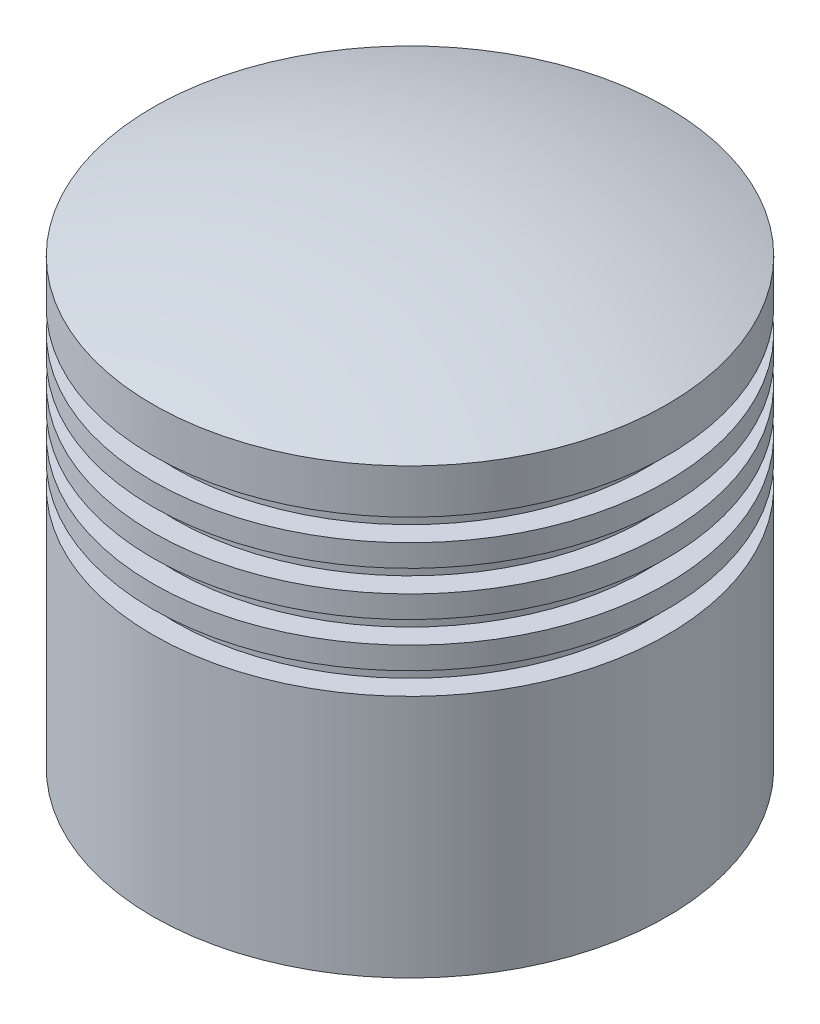
ISO-10303-21;
HEADER;
FILE_DESCRIPTION(('STEP AP214'),'2;1');
FILE_NAME('part.step','',(''),(''),'','','');
FILE_SCHEMA(('AUTOMOTIVE_DESIGN { 1 0 10303 214 1 1 1 1 }'));
ENDSEC;
DATA;
#1=APPLICATION_CONTEXT('core data for automotive mechanical design processes');
#2=APPLICATION_PROTOCOL_DEFINITION('international standard','automotive_design',2000,#1);
#3=PRODUCT_CONTEXT('',#1,'mechanical');
#4=PRODUCT('Part','Part','',(#3));
#5=PRODUCT_RELATED_PRODUCT_CATEGORY('part','',(#4));
#6=PRODUCT_DEFINITION_FORMATION('','',#4);
#7=PRODUCT_DEFINITION_CONTEXT('part definition',#1,'design');
#8=PRODUCT_DEFINITION('design','',#6,#7);
#9=PRODUCT_DEFINITION_SHAPE('','',#8);
#10=(LENGTH_UNIT() NAMED_UNIT(*) SI_UNIT(.MILLI.,.METRE.));
#11=(NAMED_UNIT(*) PLANE_ANGLE_UNIT() SI_UNIT($,.RADIAN.));
#12=(NAMED_UNIT(*) SI_UNIT($,.STERADIAN.) SOLID_ANGLE_UNIT());
#13=UNCERTAINTY_MEASURE_WITH_UNIT(LENGTH_MEASURE(1.E-05),#10,'distance_accuracy_value','');
#14=(GEOMETRIC_REPRESENTATION_CONTEXT(3) GLOBAL_UNCERTAINTY_ASSIGNED_CONTEXT((#13)) GLOBAL_UNIT_ASSIGNED_CONTEXT((#10,
#11,#12)) REPRESENTATION_CONTEXT('',''));
#15=CARTESIAN_POINT('',(0.,0.,0.));
#16=DIRECTION('',(0.,0.,1.));
#17=DIRECTION('',(1.,0.,0.));
#18=AXIS2_PLACEMENT_3D('',#15,#16,#17);
#19=CARTESIAN_POINT('',(50.,0.,0.));
#20=DIRECTION('',(0.,-1.,0.));
#21=DIRECTION('',(0.,0.,-1.));
#22=AXIS2_PLACEMENT_3D('',#19,#20,#21);
#23=PLANE('',#22);
#24=CARTESIAN_POINT('',(0.,0.,0.));
#25=DIRECTION('',(0.,-1.,0.));
#26=DIRECTION('',(0.,0.,-1.));
#27=AXIS2_PLACEMENT_3D('',#24,#25,#26);
#28=CIRCLE('',#27,58.);
#29=CARTESIAN_POINT('',(0.,0.,-58.));
#30=VERTEX_POINT('',#29);
#31=EDGE_CURVE('E10',#30,#30,#28,.T.);
#32=ORIENTED_EDGE('',*,*,#31,.T.);
#33=EDGE_LOOP('',(#32));
#34=FACE_BOUND('',#33,.T.);
#35=CARTESIAN_POINT('',(0.,0.,0.));
#36=DIRECTION('',(0.,-1.,0.));
#37=DIRECTION('',(0.,0.,-1.));
#38=AXIS2_PLACEMENT_3D('',#35,#36,#37);
#39=CIRCLE('',#38,50.);
#40=CARTESIAN_POINT('',(0.,0.,-50.));
#41=VERTEX_POINT('',#40);
#42=EDGE_CURVE('E132',#41,#41,#39,.T.);
#43=ORIENTED_EDGE('',*,*,#42,.F.);
#44=EDGE_LOOP('',(#43));
#45=FACE_BOUND('',#44,.T.);
#46=ADVANCED_FACE('F41',(#34,#45),#23,.T.);
#47=CARTESIAN_POINT('',(0.,0.,0.));
#48=DIRECTION('',(0.,-1.,0.));
#49=DIRECTION('',(0.,0.,-1.));
#50=AXIS2_PLACEMENT_3D('',#47,#48,#49);
#51=CYLINDRICAL_SURFACE('',#50,58.);
#52=CARTESIAN_POINT('',(0.,55.,0.));
#53=DIRECTION('',(0.,-1.,0.));
#54=DIRECTION('',(0.,0.,-1.));
#55=AXIS2_PLACEMENT_3D('',#52,#53,#54);
#56=CIRCLE('',#55,58.);
#57=CARTESIAN_POINT('',(0.,55.,-58.));
#58=VERTEX_POINT('',#57);
#59=EDGE_CURVE('E48',#58,#58,#56,.T.);
#60=ORIENTED_EDGE('',*,*,#59,.T.);
#61=EDGE_LOOP('',(#60));
#62=FACE_BOUND('',#61,.T.);
#63=ORIENTED_EDGE('',*,*,#31,.F.);
#64=EDGE_LOOP('',(#63));
#65=FACE_BOUND('',#64,.T.);
#66=ADVANCED_FACE('F141',(#62,#65),#51,.T.);
#67=CARTESIAN_POINT('',(58.,55.,0.));
#68=DIRECTION('',(0.,1.,0.));
#69=DIRECTION('',(0.,0.,1.));
#70=AXIS2_PLACEMENT_3D('',#67,#68,#69);
#71=PLANE('',#70);
#72=CARTESIAN_POINT('',(0.,55.,0.));
#73=DIRECTION('',(0.,-1.,0.));
#74=DIRECTION('',(0.,0.,-1.));
#75=AXIS2_PLACEMENT_3D('',#72,#73,#74);
#76=CIRCLE('',#75,53.);
#77=CARTESIAN_POINT('',(0.,55.,-53.));
#78=VERTEX_POINT('',#77);
#79=EDGE_CURVE('E53',#78,#78,#76,.T.);
#80=ORIENTED_EDGE('',*,*,#79,.T.);
#81=EDGE_LOOP('',(#80));
#82=FACE_BOUND('',#81,.T.);
#83=ORIENTED_EDGE('',*,*,#59,.F.);
#84=EDGE_LOOP('',(#83));
#85=FACE_BOUND('',#84,.T.);
#86=ADVANCED_FACE('F145',(#82,#85),#71,.T.);
#87=CARTESIAN_POINT('',(0.,0.,0.));
#88=DIRECTION('',(0.,-1.,0.));
#89=DIRECTION('',(0.,0.,-1.));
#90=AXIS2_PLACEMENT_3D('',#87,#88,#89);
#91=CYLINDRICAL_SURFACE('',#90,53.);
#92=CARTESIAN_POINT('',(0.,60.,0.));
#93=DIRECTION('',(0.,-1.,0.));
#94=DIRECTION('',(0.,0.,-1.));
#95=AXIS2_PLACEMENT_3D('',#92,#93,#94);
#96=CIRCLE('',#95,53.);
#97=CARTESIAN_POINT('',(0.,60.,-53.));
#98=VERTEX_POINT('',#97);
#99=EDGE_CURVE('E58',#98,#98,#96,.T.);
#100=ORIENTED_EDGE('',*,*,#99,.T.);
#101=EDGE_LOOP('',(#100));
#102=FACE_BOUND('',#101,.T.);
#103=ORIENTED_EDGE('',*,*,#79,.F.);
#104=EDGE_LOOP('',(#103));
#105=FACE_BOUND('',#104,.T.);
#106=ADVANCED_FACE('F149',(#102,#105),#91,.T.);
#107=CARTESIAN_POINT('',(53.,60.,0.));
#108=DIRECTION('',(0.,-1.,0.));
#109=DIRECTION('',(0.,0.,-1.));
#110=AXIS2_PLACEMENT_3D('',#107,#108,#109);
#111=PLANE('',#110);
#112=CARTESIAN_POINT('',(0.,60.,0.));
#113=DIRECTION('',(0.,-1.,0.));
#114=DIRECTION('',(0.,0.,-1.));
#115=AXIS2_PLACEMENT_3D('',#112,#113,#114);
#116=CIRCLE('',#115,58.);
#117=CARTESIAN_POINT('',(0.,60.,-58.));
#118=VERTEX_POINT('',#117);
#119=EDGE_CURVE('E64',#118,#118,#116,.T.);
#120=ORIENTED_EDGE('',*,*,#119,.T.);
#121=EDGE_LOOP('',(#120));
#122=FACE_BOUND('',#121,.T.);
#123=ORIENTED_EDGE('',*,*,#99,.F.);
#124=EDGE_LOOP('',(#123));
#125=FACE_BOUND('',#124,.T.);
#126=ADVANCED_FACE('F156',(#122,#125),#111,.T.);
#127=CARTESIAN_POINT('',(0.,0.,0.));
#128=DIRECTION('',(0.,-1.,0.));
#129=DIRECTION('',(0.,0.,-1.));
#130=AXIS2_PLACEMENT_3D('',#127,#128,#129);
#131=CYLINDRICAL_SURFACE('',#130,58.);
#132=CARTESIAN_POINT('',(0.,65.,0.));
#133=DIRECTION('',(0.,-1.,0.));
#134=DIRECTION('',(0.,0.,-1.));
#135=AXIS2_PLACEMENT_3D('',#132,#133,#134);
#136=CIRCLE('',#135,58.);
#137=CARTESIAN_POINT('',(0.,65.,-58.));
#138=VERTEX_POINT('',#137);
#139=EDGE_CURVE('E68',#138,#138,#136,.T.);
#140=ORIENTED_EDGE('',*,*,#139,.T.);
#141=EDGE_LOOP('',(#140));
#142=FACE_BOUND('',#141,.T.);
#143=ORIENTED_EDGE('',*,*,#119,.F.);
#144=EDGE_LOOP('',(#143));
#145=FACE_BOUND('',#144,.T.);
#146=ADVANCED_FACE('F160',(#142,#145),#131,.T.);
#147=CARTESIAN_POINT('',(58.,65.,0.));
#148=DIRECTION('',(0.,1.,0.));
#149=DIRECTION('',(0.,0.,1.));
#150=AXIS2_PLACEMENT_3D('',#147,#148,#149);
#151=PLANE('',#150);
#152=CARTESIAN_POINT('',(0.,65.,0.));
#153=DIRECTION('',(0.,-1.,0.));
#154=DIRECTION('',(0.,0.,-1.));
#155=AXIS2_PLACEMENT_3D('',#152,#153,#154);
#156=CIRCLE('',#155,53.);
#157=CARTESIAN_POINT('',(0.,65.,-53.));
#158=VERTEX_POINT('',#157);
#159=EDGE_CURVE('E72',#158,#158,#156,.T.);
#160=ORIENTED_EDGE('',*,*,#159,.T.);
#161=EDGE_LOOP('',(#160));
#162=FACE_BOUND('',#161,.T.);
#163=ORIENTED_EDGE('',*,*,#139,.F.);
#164=EDGE_LOOP('',(#163));
#165=FACE_BOUND('',#164,.T.);
#166=ADVANCED_FACE('F164',(#162,#165),#151,.T.);
#167=CARTESIAN_POINT('',(0.,0.,0.));
#168=DIRECTION('',(0.,-1.,0.));
#169=DIRECTION('',(0.,0.,-1.));
#170=AXIS2_PLACEMENT_3D('',#167,#168,#169);
#171=CYLINDRICAL_SURFACE('',#170,53.);
#172=CARTESIAN_POINT('',(0.,70.,0.));
#173=DIRECTION('',(0.,-1.,0.));
#174=DIRECTION('',(0.,0.,-1.));
#175=AXIS2_PLACEMENT_3D('',#172,#173,#174);
#176=CIRCLE('',#175,53.);
#177=CARTESIAN_POINT('',(0.,70.,-53.));
#178=VERTEX_POINT('',#177);
#179=EDGE_CURVE('E76',#178,#178,#176,.T.);
#180=ORIENTED_EDGE('',*,*,#179,.T.);
#181=EDGE_LOOP('',(#180));
#182=FACE_BOUND('',#181,.T.);
#183=ORIENTED_EDGE('',*,*,#159,.F.);
#184=EDGE_LOOP('',(#183));
#185=FACE_BOUND('',#184,.T.);
#186=ADVANCED_FACE('F168',(#182,#185),#171,.T.);
#187=CARTESIAN_POINT('',(53.,70.,0.));
#188=DIRECTION('',(0.,-1.,0.));
#189=DIRECTION('',(0.,0.,-1.));
#190=AXIS2_PLACEMENT_3D('',#187,#188,#189);
#191=PLANE('',#190);
#192=CARTESIAN_POINT('',(0.,70.,0.));
#193=DIRECTION('',(0.,-1.,0.));
#194=DIRECTION('',(0.,0.,-1.));
#195=AXIS2_PLACEMENT_3D('',#192,#193,#194);
#196=CIRCLE('',#195,58.);
#197=CARTESIAN_POINT('',(0.,70.,-58.));
#198=VERTEX_POINT('',#197);
#199=EDGE_CURVE('E80',#198,#198,#196,.T.);
#200=ORIENTED_EDGE('',*,*,#199,.T.);
#201=EDGE_LOOP('',(#200));
#202=FACE_BOUND('',#201,.T.);
#203=ORIENTED_EDGE('',*,*,#179,.F.);
#204=EDGE_LOOP('',(#203));
#205=FACE_BOUND('',#204,.T.);
#206=ADVANCED_FACE('F172',(#202,#205),#191,.T.);
#207=CARTESIAN_POINT('',(0.,0.,0.));
#208=DIRECTION('',(0.,-1.,0.));
#209=DIRECTION('',(0.,0.,-1.));
#210=AXIS2_PLACEMENT_3D('',#207,#208,#209);
#211=CYLINDRICAL_SURFACE('',#210,58.);
#212=CARTESIAN_POINT('',(0.,75.,0.));
#213=DIRECTION('',(0.,-1.,0.));
#214=DIRECTION('',(0.,0.,-1.));
#215=AXIS2_PLACEMENT_3D('',#212,#213,#214);
#216=CIRCLE('',#215,58.);
#217=CARTESIAN_POINT('',(0.,75.,-58.));
#218=VERTEX_POINT('',#217);
#219=EDGE_CURVE('E84',#218,#218,#216,.T.);
#220=ORIENTED_EDGE('',*,*,#219,.T.);
#221=EDGE_LOOP('',(#220));
#222=FACE_BOUND('',#221,.T.);
#223=ORIENTED_EDGE('',*,*,#199,.F.);
#224=EDGE_LOOP('',(#223));
#225=FACE_BOUND('',#224,.T.);
#226=ADVANCED_FACE('F176',(#222,#225),#211,.T.);
#227=CARTESIAN_POINT('',(58.,75.,0.));
#228=DIRECTION('',(0.,1.,0.));
#229=DIRECTION('',(0.,0.,1.));
#230=AXIS2_PLACEMENT_3D('',#227,#228,#229);
#231=PLANE('',#230);
#232=CARTESIAN_POINT('',(0.,75.,0.));
#233=DIRECTION('',(0.,-1.,0.));
#234=DIRECTION('',(0.,0.,-1.));
#235=AXIS2_PLACEMENT_3D('',#232,#233,#234);
#236=CIRCLE('',#235,53.);
#237=CARTESIAN_POINT('',(0.,75.,-53.));
#238=VERTEX_POINT('',#237);
#239=EDGE_CURVE('E88',#238,#238,#236,.T.);
#240=ORIENTED_EDGE('',*,*,#239,.T.);
#241=EDGE_LOOP('',(#240));
#242=FACE_BOUND('',#241,.T.);
#243=ORIENTED_EDGE('',*,*,#219,.F.);
#244=EDGE_LOOP('',(#243));
#245=FACE_BOUND('',#244,.T.);
#246=ADVANCED_FACE('F180',(#242,#245),#231,.T.);
#247=CARTESIAN_POINT('',(0.,0.,0.));
#248=DIRECTION('',(0.,-1.,0.));
#249=DIRECTION('',(0.,0.,-1.));
#250=AXIS2_PLACEMENT_3D('',#247,#248,#249);
#251=CYLINDRICAL_SURFACE('',#250,53.);
#252=CARTESIAN_POINT('',(0.,80.,0.));
#253=DIRECTION('',(0.,-1.,0.));
#254=DIRECTION('',(0.,0.,-1.));
#255=AXIS2_PLACEMENT_3D('',#252,#253,#254);
#256=CIRCLE('',#255,53.);
#257=CARTESIAN_POINT('',(0.,80.,-53.));
#258=VERTEX_POINT('',#257);
#259=EDGE_CURVE('E92',#258,#258,#256,.T.);
#260=ORIENTED_EDGE('',*,*,#259,.T.);
#261=EDGE_LOOP('',(#260));
#262=FACE_BOUND('',#261,.T.);
#263=ORIENTED_EDGE('',*,*,#239,.F.);
#264=EDGE_LOOP('',(#263));
#265=FACE_BOUND('',#264,.T.);
#266=ADVANCED_FACE('F184',(#262,#265),#251,.T.);
#267=CARTESIAN_POINT('',(53.,80.,0.));
#268=DIRECTION('',(0.,-1.,0.));
#269=DIRECTION('',(0.,0.,-1.));
#270=AXIS2_PLACEMENT_3D('',#267,#268,#269);
#271=PLANE('',#270);
#272=CARTESIAN_POINT('',(0.,80.,0.));
#273=DIRECTION('',(0.,-1.,0.));
#274=DIRECTION('',(0.,0.,-1.));
#275=AXIS2_PLACEMENT_3D('',#272,#273,#274);
#276=CIRCLE('',#275,58.);
#277=CARTESIAN_POINT('',(0.,80.,-58.));
#278=VERTEX_POINT('',#277);
#279=EDGE_CURVE('E96',#278,#278,#276,.T.);
#280=ORIENTED_EDGE('',*,*,#279,.T.);
#281=EDGE_LOOP('',(#280));
#282=FACE_BOUND('',#281,.T.);
#283=ORIENTED_EDGE('',*,*,#259,.F.);
#284=EDGE_LOOP('',(#283));
#285=FACE_BOUND('',#284,.T.);
#286=ADVANCED_FACE('F188',(#282,#285),#271,.T.);
#287=CARTESIAN_POINT('',(0.,0.,0.));
#288=DIRECTION('',(0.,-1.,0.));
#289=DIRECTION('',(0.,0.,-1.));
#290=AXIS2_PLACEMENT_3D('',#287,#288,#289);
#291=CYLINDRICAL_SURFACE('',#290,58.);
#292=CARTESIAN_POINT('',(0.,85.,0.));
#293=DIRECTION('',(0.,-1.,0.));
#294=DIRECTION('',(0.,0.,-1.));
#295=AXIS2_PLACEMENT_3D('',#292,#293,#294);
#296=CIRCLE('',#295,58.);
#297=CARTESIAN_POINT('',(0.,85.,-58.));
#298=VERTEX_POINT('',#297);
#299=EDGE_CURVE('E100',#298,#298,#296,.T.);
#300=ORIENTED_EDGE('',*,*,#299,.T.);
#301=EDGE_LOOP('',(#300));
#302=FACE_BOUND('',#301,.T.);
#303=ORIENTED_EDGE('',*,*,#279,.F.);
#304=EDGE_LOOP('',(#303));
#305=FACE_BOUND('',#304,.T.);
#306=ADVANCED_FACE('F192',(#302,#305),#291,.T.);
#307=CARTESIAN_POINT('',(58.,85.,0.));
#308=DIRECTION('',(0.,1.,0.));
#309=DIRECTION('',(0.,0.,1.));
#310=AXIS2_PLACEMENT_3D('',#307,#308,#309);
#311=PLANE('',#310);
#312=CARTESIAN_POINT('',(0.,85.,0.));
#313=DIRECTION('',(0.,-1.,0.));
#314=DIRECTION('',(0.,0.,-1.));
#315=AXIS2_PLACEMENT_3D('',#312,#313,#314);
#316=CIRCLE('',#315,53.);
#317=CARTESIAN_POINT('',(0.,85.,-53.));
#318=VERTEX_POINT('',#317);
#319=EDGE_CURVE('E104',#318,#318,#316,.T.);
#320=ORIENTED_EDGE('',*,*,#319,.T.);
#321=EDGE_LOOP('',(#320));
#322=FACE_BOUND('',#321,.T.);
#323=ORIENTED_EDGE('',*,*,#299,.F.);
#324=EDGE_LOOP('',(#323));
#325=FACE_BOUND('',#324,.T.);
#326=ADVANCED_FACE('F196',(#322,#325),#311,.T.);
#327=CARTESIAN_POINT('',(0.,0.,0.));
#328=DIRECTION('',(0.,-1.,0.));
#329=DIRECTION('',(0.,0.,-1.));
#330=AXIS2_PLACEMENT_3D('',#327,#328,#329);
#331=CYLINDRICAL_SURFACE('',#330,53.);
#332=CARTESIAN_POINT('',(0.,90.,0.));
#333=DIRECTION('',(0.,-1.,0.));
#334=DIRECTION('',(0.,0.,-1.));
#335=AXIS2_PLACEMENT_3D('',#332,#333,#334);
#336=CIRCLE('',#335,53.);
#337=CARTESIAN_POINT('',(0.,90.,-53.));
#338=VERTEX_POINT('',#337);
#339=EDGE_CURVE('E108',#338,#338,#336,.T.);
#340=ORIENTED_EDGE('',*,*,#339,.T.);
#341=EDGE_LOOP('',(#340));
#342=FACE_BOUND('',#341,.T.);
#343=ORIENTED_EDGE('',*,*,#319,.F.);
#344=EDGE_LOOP('',(#343));
#345=FACE_BOUND('',#344,.T.);
#346=ADVANCED_FACE('F200',(#342,#345),#331,.T.);
#347=CARTESIAN_POINT('',(53.,90.,0.));
#348=DIRECTION('',(0.,-1.,0.));
#349=DIRECTION('',(0.,0.,-1.));
#350=AXIS2_PLACEMENT_3D('',#347,#348,#349);
#351=PLANE('',#350);
#352=CARTESIAN_POINT('',(0.,90.,0.));
#353=DIRECTION('',(0.,-1.,0.));
#354=DIRECTION('',(0.,0.,-1.));
#355=AXIS2_PLACEMENT_3D('',#352,#353,#354);
#356=CIRCLE('',#355,58.);
#357=CARTESIAN_POINT('',(0.,90.,-58.));
#358=VERTEX_POINT('',#357);
#359=EDGE_CURVE('E112',#358,#358,#356,.T.);
#360=ORIENTED_EDGE('',*,*,#359,.T.);
#361=EDGE_LOOP('',(#360));
#362=FACE_BOUND('',#361,.T.);
#363=ORIENTED_EDGE('',*,*,#339,.F.);
#364=EDGE_LOOP('',(#363));
#365=FACE_BOUND('',#364,.T.);
#366=ADVANCED_FACE('F204',(#362,#365),#351,.T.);
#367=CARTESIAN_POINT('',(0.,0.,0.));
#368=DIRECTION('',(0.,-1.,0.));
#369=DIRECTION('',(0.,0.,-1.));
#370=AXIS2_PLACEMENT_3D('',#367,#368,#369);
#371=CYLINDRICAL_SURFACE('',#370,58.);
#372=CARTESIAN_POINT('',(0.,100.,0.));
#373=DIRECTION('',(0.,-1.,0.));
#374=DIRECTION('',(0.,0.,-1.));
#375=AXIS2_PLACEMENT_3D('',#372,#373,#374);
#376=CIRCLE('',#375,58.);
#377=CARTESIAN_POINT('',(0.,100.,-58.));
#378=VERTEX_POINT('',#377);
#379=EDGE_CURVE('E116',#378,#378,#376,.T.);
#380=ORIENTED_EDGE('',*,*,#379,.T.);
#381=EDGE_LOOP('',(#380));
#382=FACE_BOUND('',#381,.T.);
#383=ORIENTED_EDGE('',*,*,#359,.F.);
#384=EDGE_LOOP('',(#383));
#385=FACE_BOUND('',#384,.T.);
#386=ADVANCED_FACE('F208',(#382,#385),#371,.T.);
#387=CARTESIAN_POINT('',(0.,-59.7998748435054,0.));
#388=DIRECTION('',(0.,-1.,0.));
#389=DIRECTION('',(1.,0.,0.));
#390=AXIS2_PLACEMENT_3D('',#387,#388,#389);
#391=SPHERICAL_SURFACE('',#390,170.);
#392=ORIENTED_EDGE('',*,*,#379,.F.);
#393=EDGE_LOOP('',(#392));
#394=FACE_BOUND('',#393,.T.);
#395=ADVANCED_FACE('F212',(#394),#391,.T.);
#396=CARTESIAN_POINT('',(0.,-59.7998748435054,0.));
#397=DIRECTION('',(0.,-1.,0.));
#398=DIRECTION('',(1.,0.,0.));
#399=AXIS2_PLACEMENT_3D('',#396,#397,#398);
#400=SPHERICAL_SURFACE('',#399,163.);
#401=CARTESIAN_POINT('',(0.,97.4260772127629,0.));
#402=DIRECTION('',(0.,-1.,0.));
#403=DIRECTION('',(0.,0.,-1.));
#404=AXIS2_PLACEMENT_3D('',#401,#402,#403);
#405=CIRCLE('',#404,43.);
#406=CARTESIAN_POINT('',(0.,97.4260772127629,-43.));
#407=VERTEX_POINT('',#406);
#408=EDGE_CURVE('E120',#407,#407,#405,.T.);
#409=ORIENTED_EDGE('',*,*,#408,.T.);
#410=EDGE_LOOP('',(#409));
#411=FACE_BOUND('',#410,.T.);
#412=ADVANCED_FACE('F216',(#411),#400,.F.);
#413=CARTESIAN_POINT('',(0.,0.,0.));
#414=DIRECTION('',(0.,-1.,0.));
#415=DIRECTION('',(0.,0.,-1.));
#416=AXIS2_PLACEMENT_3D('',#413,#414,#415);
#417=CYLINDRICAL_SURFACE('',#416,43.);
#418=CARTESIAN_POINT('',(0.,30.,0.));
#419=DIRECTION('',(0.,-1.,0.));
#420=DIRECTION('',(0.,0.,-1.));
#421=AXIS2_PLACEMENT_3D('',#418,#419,#420);
#422=CIRCLE('',#421,43.);
#423=CARTESIAN_POINT('',(0.,30.,-43.));
#424=VERTEX_POINT('',#423);
#425=EDGE_CURVE('E124',#424,#424,#422,.T.);
#426=ORIENTED_EDGE('',*,*,#425,.T.);
#427=EDGE_LOOP('',(#426));
#428=FACE_BOUND('',#427,.T.);
#429=ORIENTED_EDGE('',*,*,#408,.F.);
#430=EDGE_LOOP('',(#429));
#431=FACE_BOUND('',#430,.T.);
#432=ADVANCED_FACE('F220',(#428,#431),#417,.F.);
#433=CARTESIAN_POINT('',(43.,30.,0.));
#434=DIRECTION('',(0.,-1.,0.));
#435=DIRECTION('',(0.,0.,-1.));
#436=AXIS2_PLACEMENT_3D('',#433,#434,#435);
#437=PLANE('',#436);
#438=CARTESIAN_POINT('',(0.,30.,0.));
#439=DIRECTION('',(0.,-1.,0.));
#440=DIRECTION('',(0.,0.,-1.));
#441=AXIS2_PLACEMENT_3D('',#438,#439,#440);
#442=CIRCLE('',#441,50.);
#443=CARTESIAN_POINT('',(0.,30.,-50.));
#444=VERTEX_POINT('',#443);
#445=EDGE_CURVE('E128',#444,#444,#442,.T.);
#446=ORIENTED_EDGE('',*,*,#445,.T.);
#447=EDGE_LOOP('',(#446));
#448=FACE_BOUND('',#447,.T.);
#449=ORIENTED_EDGE('',*,*,#425,.F.);
#450=EDGE_LOOP('',(#449));
#451=FACE_BOUND('',#450,.T.);
#452=ADVANCED_FACE('F224',(#448,#451),#437,.T.);
#453=CARTESIAN_POINT('',(0.,0.,0.));
#454=DIRECTION('',(0.,-1.,0.));
#455=DIRECTION('',(0.,0.,-1.));
#456=AXIS2_PLACEMENT_3D('',#453,#454,#455);
#457=CYLINDRICAL_SURFACE('',#456,50.);
#458=ORIENTED_EDGE('',*,*,#42,.T.);
#459=EDGE_LOOP('',(#458));
#460=FACE_BOUND('',#459,.T.);
#461=ORIENTED_EDGE('',*,*,#445,.F.);
#462=EDGE_LOOP('',(#461));
#463=FACE_BOUND('',#462,.T.);
#464=ADVANCED_FACE('F137',(#460,#463),#457,.F.);
#465=CLOSED_SHELL('',(#46,#66,#86,#106,#126,#146,#166,#186,#206,#226,#246,#266,#286,#306,#326,
#346,#366,#386,#395,#412,#432,#452,#464));
#466=MANIFOLD_SOLID_BREP('B2',#465);
#467=ADVANCED_BREP_SHAPE_REPRESENTATION('',(#18,#466),#14);
#468=SHAPE_DEFINITION_REPRESENTATION(#9,#467);
ENDSEC;
END-ISO-10303-21;
